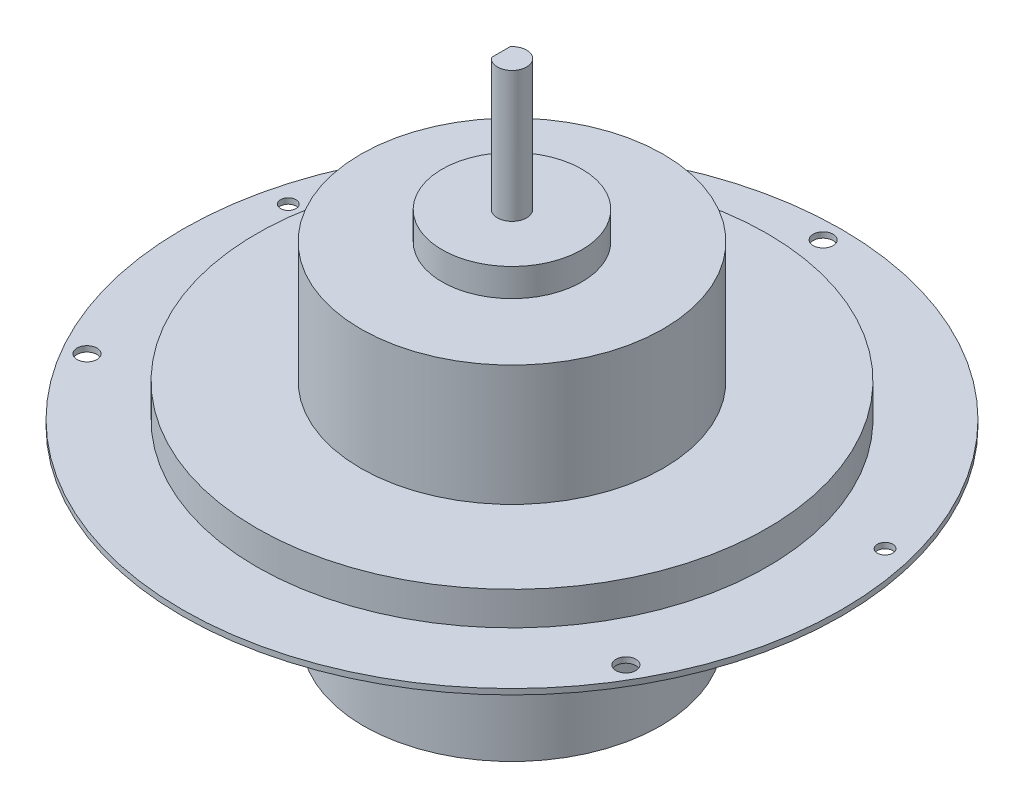
ISO-10303-21;
HEADER;
FILE_DESCRIPTION(('STEP AP214'),'2;1');
FILE_NAME('part.step','',(''),(''),'','','');
FILE_SCHEMA(('AUTOMOTIVE_DESIGN { 1 0 10303 214 1 1 1 1 }'));
ENDSEC;
DATA;
#1=APPLICATION_CONTEXT('core data for automotive mechanical design processes');
#2=APPLICATION_PROTOCOL_DEFINITION('international standard','automotive_design',2000,#1);
#3=PRODUCT_CONTEXT('',#1,'mechanical');
#4=PRODUCT('Part','Part','',(#3));
#5=PRODUCT_RELATED_PRODUCT_CATEGORY('part','',(#4));
#6=PRODUCT_DEFINITION_FORMATION('','',#4);
#7=PRODUCT_DEFINITION_CONTEXT('part definition',#1,'design');
#8=PRODUCT_DEFINITION('design','',#6,#7);
#9=PRODUCT_DEFINITION_SHAPE('','',#8);
#10=(LENGTH_UNIT() NAMED_UNIT(*) SI_UNIT(.MILLI.,.METRE.));
#11=(NAMED_UNIT(*) PLANE_ANGLE_UNIT() SI_UNIT($,.RADIAN.));
#12=(NAMED_UNIT(*) SI_UNIT($,.STERADIAN.) SOLID_ANGLE_UNIT());
#13=UNCERTAINTY_MEASURE_WITH_UNIT(LENGTH_MEASURE(1.E-05),#10,'distance_accuracy_value','');
#14=(GEOMETRIC_REPRESENTATION_CONTEXT(3) GLOBAL_UNCERTAINTY_ASSIGNED_CONTEXT((#13)) GLOBAL_UNIT_ASSIGNED_CONTEXT((#10,
#11,#12)) REPRESENTATION_CONTEXT('',''));
#15=CARTESIAN_POINT('',(0.,0.,0.));
#16=DIRECTION('',(0.,0.,1.));
#17=DIRECTION('',(1.,0.,0.));
#18=AXIS2_PLACEMENT_3D('',#15,#16,#17);
#19=CARTESIAN_POINT('',(0.,0.762000000000013,0.));
#20=DIRECTION('',(0.,-1.,0.));
#21=DIRECTION('',(0.,0.,-1.));
#22=AXIS2_PLACEMENT_3D('',#19,#20,#21);
#23=CYLINDRICAL_SURFACE('',#22,90.17);
#24=CARTESIAN_POINT('',(0.,0.762000000000013,0.));
#25=DIRECTION('',(0.,1.,0.));
#26=DIRECTION('',(0.,0.,1.));
#27=AXIS2_PLACEMENT_3D('',#24,#25,#26);
#28=CIRCLE('',#27,90.17);
#29=CARTESIAN_POINT('',(0.,0.762000000000013,-90.17));
#30=VERTEX_POINT('',#29);
#31=EDGE_CURVE('E122',#30,#30,#28,.T.);
#32=CARTESIAN_POINT('',(0.,-0.762000000000013,0.));
#33=DIRECTION('',(0.,1.,0.));
#34=DIRECTION('',(0.,0.,1.));
#35=AXIS2_PLACEMENT_3D('',#32,#33,#34);
#36=CIRCLE('',#35,90.17);
#37=CARTESIAN_POINT('',(0.,-0.762000000000013,-90.17));
#38=VERTEX_POINT('',#37);
#39=EDGE_CURVE('E118',#38,#38,#36,.T.);
#40=CARTESIAN_POINT('',(0.,0.762000000000013,-90.17));
#41=CARTESIAN_POINT('',(0.,0.746125000000012,-90.17));
#42=CARTESIAN_POINT('',(0.,0.730250000000012,-90.17));
#43=CARTESIAN_POINT('',(0.,0.698500000000012,-90.17));
#44=CARTESIAN_POINT('',(0.,0.682625000000011,-90.17));
#45=CARTESIAN_POINT('',(0.,0.650875000000011,-90.17));
#46=CARTESIAN_POINT('',(0.,0.63500000000001,-90.17));
#47=CARTESIAN_POINT('',(0.,0.60325000000001,-90.17));
#48=CARTESIAN_POINT('',(0.,0.58737500000001,-90.17));
#49=CARTESIAN_POINT('',(0.,0.555625000000009,-90.17));
#50=CARTESIAN_POINT('',(0.,0.539750000000009,-90.17));
#51=CARTESIAN_POINT('',(0.,0.508000000000008,-90.17));
#52=CARTESIAN_POINT('',(0.,0.492125000000008,-90.17));
#53=CARTESIAN_POINT('',(0.,0.460375000000008,-90.17));
#54=CARTESIAN_POINT('',(0.,0.444500000000007,-90.17));
#55=CARTESIAN_POINT('',(0.,0.412750000000007,-90.17));
#56=CARTESIAN_POINT('',(0.,0.396875000000006,-90.17));
#57=CARTESIAN_POINT('',(0.,0.365125000000006,-90.17));
#58=CARTESIAN_POINT('',(0.,0.349250000000006,-90.17));
#59=CARTESIAN_POINT('',(0.,0.317500000000005,-90.17));
#60=CARTESIAN_POINT('',(0.,0.301625000000005,-90.17));
#61=CARTESIAN_POINT('',(0.,0.269875000000004,-90.17));
#62=CARTESIAN_POINT('',(0.,0.254000000000004,-90.17));
#63=CARTESIAN_POINT('',(0.,0.222250000000004,-90.17));
#64=CARTESIAN_POINT('',(0.,0.206375000000003,-90.17));
#65=CARTESIAN_POINT('',(0.,0.174625000000003,-90.17));
#66=CARTESIAN_POINT('',(0.,0.158750000000002,-90.17));
#67=CARTESIAN_POINT('',(0.,0.127000000000002,-90.17));
#68=CARTESIAN_POINT('',(0.,0.111125000000002,-90.17));
#69=CARTESIAN_POINT('',(0.,0.0793750000000011,-90.17));
#70=CARTESIAN_POINT('',(0.,0.0635000000000008,-90.17));
#71=CARTESIAN_POINT('',(0.,0.0317500000000003,-90.17));
#72=CARTESIAN_POINT('',(0.,0.015875,-90.17));
#73=CARTESIAN_POINT('',(0.,-0.0158750000000005,-90.17));
#74=CARTESIAN_POINT('',(0.,-0.0317500000000007,-90.17));
#75=CARTESIAN_POINT('',(0.,-0.0635000000000013,-90.17));
#76=CARTESIAN_POINT('',(0.,-0.0793750000000015,-90.17));
#77=CARTESIAN_POINT('',(0.,-0.111125000000002,-90.17));
#78=CARTESIAN_POINT('',(0.,-0.127000000000002,-90.17));
#79=CARTESIAN_POINT('',(0.,-0.158750000000003,-90.17));
#80=CARTESIAN_POINT('',(0.,-0.174625000000003,-90.17));
#81=CARTESIAN_POINT('',(0.,-0.206375000000004,-90.17));
#82=CARTESIAN_POINT('',(0.,-0.222250000000004,-90.17));
#83=CARTESIAN_POINT('',(0.,-0.254000000000004,-90.17));
#84=CARTESIAN_POINT('',(0.,-0.269875000000004,-90.17));
#85=CARTESIAN_POINT('',(0.,-0.301625000000005,-90.17));
#86=CARTESIAN_POINT('',(0.,-0.317500000000005,-90.17));
#87=CARTESIAN_POINT('',(0.,-0.349250000000006,-90.17));
#88=CARTESIAN_POINT('',(0.,-0.365125000000006,-90.17));
#89=CARTESIAN_POINT('',(0.,-0.396875000000007,-90.17));
#90=CARTESIAN_POINT('',(0.,-0.412750000000007,-90.17));
#91=CARTESIAN_POINT('',(0.,-0.444500000000008,-90.17));
#92=CARTESIAN_POINT('',(0.,-0.460375000000008,-90.17));
#93=CARTESIAN_POINT('',(0.,-0.492125000000008,-90.17));
#94=CARTESIAN_POINT('',(0.,-0.508000000000009,-90.17));
#95=CARTESIAN_POINT('',(0.,-0.539750000000009,-90.17));
#96=CARTESIAN_POINT('',(0.,-0.555625000000009,-90.17));
#97=CARTESIAN_POINT('',(0.,-0.58737500000001,-90.17));
#98=CARTESIAN_POINT('',(0.,-0.60325000000001,-90.17));
#99=CARTESIAN_POINT('',(0.,-0.635000000000011,-90.17));
#100=CARTESIAN_POINT('',(0.,-0.650875000000011,-90.17));
#101=CARTESIAN_POINT('',(0.,-0.682625000000012,-90.17));
#102=CARTESIAN_POINT('',(0.,-0.698500000000012,-90.17));
#103=CARTESIAN_POINT('',(0.,-0.730250000000012,-90.17));
#104=CARTESIAN_POINT('',(0.,-0.746125000000013,-90.17));
#105=CARTESIAN_POINT('',(0.,-0.762000000000013,-90.17));
#106=B_SPLINE_CURVE_WITH_KNOTS('',3,(#40,#41,#42,#43,#44,#45,#46,#47,#48,#49,#50,#51,#52,#53,
#54,#55,#56,#57,#58,#59,#60,#61,#62,#63,#64,#65,#66,#67,#68,#69,#70,#71,#72,#73,#74,#75,#76,#77,
#78,#79,#80,#81,#82,#83,#84,#85,#86,#87,#88,#89,#90,#91,#92,#93,#94,#95,#96,#97,#98,#99,#100,
#101,#102,#103,#104,#105),.UNSPECIFIED.,.F.,.F.,(4,2,2,2,2,2,2,2,2,2,2,2,2,2,2,2,2,2,2,2,2,2,2,
2,2,2,2,2,2,2,2,2,4),(0.,0.0476250000000008,0.0952500000000016,0.142875000000002,
0.190500000000003,0.238125000000004,0.285750000000005,0.333375000000006,0.381000000000006,
0.428625000000007,0.476250000000008,0.523875000000009,0.57150000000001,0.61912500000001,
0.666750000000011,0.714375000000012,0.762000000000013,0.809625000000014,0.857250000000014,
0.904875000000015,0.952500000000016,1.00012500000002,1.04775000000002,1.09537500000002,
1.14300000000002,1.19062500000002,1.23825000000002,1.28587500000002,1.33350000000002,
1.38112500000002,1.42875000000002,1.47637500000002,1.52400000000003),.UNSPECIFIED.);
#107=EDGE_CURVE('BSEAM42',#30,#38,#106,.T.);
#108=ORIENTED_EDGE('',*,*,#31,.F.);
#109=ORIENTED_EDGE('',*,*,#39,.T.);
#110=ORIENTED_EDGE('',*,*,#107,.T.);
#111=ORIENTED_EDGE('',*,*,#107,.F.);
#112=EDGE_LOOP('',(#108,#110,#109,#111));
#113=FACE_BOUND('',#112,.T.);
#114=ADVANCED_FACE('F42',(#113),#23,.T.);
#115=CARTESIAN_POINT('',(0.,0.762000000000013,0.));
#116=DIRECTION('',(0.,1.,0.));
#117=DIRECTION('',(0.,0.,1.));
#118=AXIS2_PLACEMENT_3D('',#115,#116,#117);
#119=PLANE('',#118);
#120=CARTESIAN_POINT('',(-81.657901206185,0.762000000000013,-20.4332769266442));
#121=DIRECTION('',(0.,1.,0.));
#122=DIRECTION('',(0.,0.,1.));
#123=AXIS2_PLACEMENT_3D('',#120,#121,#122);
#124=CIRCLE('',#123,2.12089999999999);
#125=CARTESIAN_POINT('',(-81.657901206185,0.762000000000013,-18.3123769266442));
#126=VERTEX_POINT('',#125);
#127=EDGE_CURVE('E148',#126,#126,#124,.T.);
#128=ORIENTED_EDGE('',*,*,#127,.F.);
#129=EDGE_LOOP('',(#128));
#130=FACE_BOUND('',#129,.T.);
#131=CARTESIAN_POINT('',(81.6579012061849,0.762000000000013,-20.4332769266448));
#132=DIRECTION('',(0.,1.,0.));
#133=DIRECTION('',(0.,0.,-1.));
#134=AXIS2_PLACEMENT_3D('',#131,#132,#133);
#135=CIRCLE('',#134,2.12090000000001);
#136=CARTESIAN_POINT('',(81.6579012061849,0.762000000000013,-22.5541769266448));
#137=VERTEX_POINT('',#136);
#138=EDGE_CURVE('E376',#137,#137,#135,.T.);
#139=ORIENTED_EDGE('',*,*,#138,.F.);
#140=EDGE_LOOP('',(#139));
#141=FACE_BOUND('',#140,.T.);
#142=CARTESIAN_POINT('',(0.,0.762000000000013,-85.1408));
#143=DIRECTION('',(0.,1.,0.));
#144=DIRECTION('',(0.,0.,1.));
#145=AXIS2_PLACEMENT_3D('',#142,#143,#144);
#146=CIRCLE('',#145,2.7178);
#147=CARTESIAN_POINT('',(0.,0.762000000000013,-82.423));
#148=VERTEX_POINT('',#147);
#149=EDGE_CURVE('E136',#148,#148,#146,.T.);
#150=ORIENTED_EDGE('',*,*,#149,.F.);
#151=EDGE_LOOP('',(#150));
#152=FACE_BOUND('',#151,.T.);
#153=CARTESIAN_POINT('',(73.7340956985299,0.762000000000013,42.5704000000004));
#154=DIRECTION('',(0.,1.,0.));
#155=DIRECTION('',(0.,0.,1.));
#156=AXIS2_PLACEMENT_3D('',#153,#154,#155);
#157=CIRCLE('',#156,2.71780000000001);
#158=CARTESIAN_POINT('',(73.7340956985299,0.762000000000013,45.2882000000004));
#159=VERTEX_POINT('',#158);
#160=EDGE_CURVE('E157',#159,#159,#157,.T.);
#161=ORIENTED_EDGE('',*,*,#160,.F.);
#162=EDGE_LOOP('',(#161));
#163=FACE_BOUND('',#162,.T.);
#164=CARTESIAN_POINT('',(-73.7340956985305,0.762000000000013,42.5703999999993));
#165=DIRECTION('',(0.,1.,0.));
#166=DIRECTION('',(0.,0.,1.));
#167=AXIS2_PLACEMENT_3D('',#164,#165,#166);
#168=CIRCLE('',#167,2.7178);
#169=CARTESIAN_POINT('',(-73.7340956985305,0.762000000000013,45.2881999999993));
#170=VERTEX_POINT('',#169);
#171=EDGE_CURVE('E151',#170,#170,#168,.T.);
#172=ORIENTED_EDGE('',*,*,#171,.F.);
#173=EDGE_LOOP('',(#172));
#174=FACE_BOUND('',#173,.T.);
#175=CARTESIAN_POINT('',(0.,0.762000000000013,0.));
#176=DIRECTION('',(0.,1.,0.));
#177=DIRECTION('',(0.,0.,1.));
#178=AXIS2_PLACEMENT_3D('',#175,#176,#177);
#179=CIRCLE('',#178,69.85);
#180=CARTESIAN_POINT('',(0.,0.762000000000013,69.85));
#181=VERTEX_POINT('',#180);
#182=EDGE_CURVE('E114',#181,#181,#179,.T.);
#183=ORIENTED_EDGE('',*,*,#182,.F.);
#184=EDGE_LOOP('',(#183));
#185=FACE_BOUND('',#184,.T.);
#186=ORIENTED_EDGE('',*,*,#31,.T.);
#187=EDGE_LOOP('',(#186));
#188=FACE_BOUND('',#187,.T.);
#189=ADVANCED_FACE('F180',(#130,#141,#152,#163,#174,#185,#188),#119,.T.);
#190=CARTESIAN_POINT('',(0.,-0.762000000000013,0.));
#191=DIRECTION('',(0.,1.,0.));
#192=DIRECTION('',(0.,0.,1.));
#193=AXIS2_PLACEMENT_3D('',#190,#191,#192);
#194=PLANE('',#193);
#195=CARTESIAN_POINT('',(0.,-0.762000000000013,0.));
#196=DIRECTION('',(0.,1.,0.));
#197=DIRECTION('',(0.,0.,1.));
#198=AXIS2_PLACEMENT_3D('',#195,#196,#197);
#199=CIRCLE('',#198,40.64);
#200=CARTESIAN_POINT('',(0.,-0.762000000000013,40.6400000000001));
#201=VERTEX_POINT('',#200);
#202=EDGE_CURVE('E11',#201,#201,#199,.F.);
#203=ORIENTED_EDGE('',*,*,#202,.F.);
#204=EDGE_LOOP('',(#203));
#205=FACE_BOUND('',#204,.T.);
#206=CARTESIAN_POINT('',(-81.657901206185,-0.761999999999985,-20.4332769266442));
#207=DIRECTION('',(0.,1.,0.));
#208=DIRECTION('',(0.,0.,1.));
#209=AXIS2_PLACEMENT_3D('',#206,#207,#208);
#210=CIRCLE('',#209,2.12089999999999);
#211=CARTESIAN_POINT('',(-81.657901206185,-0.761999999999985,-18.3123769266442));
#212=VERTEX_POINT('',#211);
#213=EDGE_CURVE('E147',#212,#212,#210,.T.);
#214=ORIENTED_EDGE('',*,*,#213,.T.);
#215=EDGE_LOOP('',(#214));
#216=FACE_BOUND('',#215,.T.);
#217=CARTESIAN_POINT('',(81.6579012061849,-0.761999999999985,-20.4332769266447));
#218=DIRECTION('',(0.,1.,0.));
#219=DIRECTION('',(0.,0.,1.));
#220=AXIS2_PLACEMENT_3D('',#217,#218,#219);
#221=CIRCLE('',#220,2.12090000000001);
#222=CARTESIAN_POINT('',(81.6579012061849,-0.761999999999985,-18.3123769266447));
#223=VERTEX_POINT('',#222);
#224=EDGE_CURVE('E144',#223,#223,#221,.T.);
#225=ORIENTED_EDGE('',*,*,#224,.T.);
#226=EDGE_LOOP('',(#225));
#227=FACE_BOUND('',#226,.T.);
#228=CARTESIAN_POINT('',(0.,-0.761999999999985,-85.1407999999999));
#229=DIRECTION('',(0.,1.,0.));
#230=DIRECTION('',(0.,0.,1.));
#231=AXIS2_PLACEMENT_3D('',#228,#229,#230);
#232=CIRCLE('',#231,2.7178);
#233=CARTESIAN_POINT('',(0.,-0.761999999999985,-82.4229999999999));
#234=VERTEX_POINT('',#233);
#235=EDGE_CURVE('E140',#234,#234,#232,.T.);
#236=ORIENTED_EDGE('',*,*,#235,.T.);
#237=EDGE_LOOP('',(#236));
#238=FACE_BOUND('',#237,.T.);
#239=CARTESIAN_POINT('',(73.7340956985299,-0.761999999999985,42.5704000000004));
#240=DIRECTION('',(0.,1.,0.));
#241=DIRECTION('',(0.,0.,1.));
#242=AXIS2_PLACEMENT_3D('',#239,#240,#241);
#243=CIRCLE('',#242,2.71780000000001);
#244=CARTESIAN_POINT('',(73.7340956985299,-0.761999999999985,45.2882000000004));
#245=VERTEX_POINT('',#244);
#246=EDGE_CURVE('E135',#245,#245,#243,.T.);
#247=ORIENTED_EDGE('',*,*,#246,.T.);
#248=EDGE_LOOP('',(#247));
#249=FACE_BOUND('',#248,.T.);
#250=CARTESIAN_POINT('',(-73.7340956985305,-0.761999999999985,42.5703999999993));
#251=DIRECTION('',(0.,1.,0.));
#252=DIRECTION('',(0.,0.,1.));
#253=AXIS2_PLACEMENT_3D('',#250,#251,#252);
#254=CIRCLE('',#253,2.7178);
#255=CARTESIAN_POINT('',(-73.7340956985305,-0.761999999999985,45.2881999999993));
#256=VERTEX_POINT('',#255);
#257=EDGE_CURVE('E131',#256,#256,#254,.T.);
#258=ORIENTED_EDGE('',*,*,#257,.T.);
#259=EDGE_LOOP('',(#258));
#260=FACE_BOUND('',#259,.T.);
#261=ORIENTED_EDGE('',*,*,#39,.F.);
#262=EDGE_LOOP('',(#261));
#263=FACE_BOUND('',#262,.T.);
#264=ADVANCED_FACE('F185',(#205,#216,#227,#238,#249,#260,#263),#194,.F.);
#265=CARTESIAN_POINT('',(0.,9.906,0.));
#266=DIRECTION('',(0.,-1.,0.));
#267=DIRECTION('',(0.,0.,-1.));
#268=AXIS2_PLACEMENT_3D('',#265,#266,#267);
#269=CYLINDRICAL_SURFACE('',#268,69.85);
#270=CARTESIAN_POINT('',(0.,9.906,0.));
#271=DIRECTION('',(0.,1.,0.));
#272=DIRECTION('',(0.,0.,1.));
#273=AXIS2_PLACEMENT_3D('',#270,#271,#272);
#274=CIRCLE('',#273,69.85);
#275=CARTESIAN_POINT('',(0.,9.906,69.85));
#276=VERTEX_POINT('',#275);
#277=EDGE_CURVE('E110',#276,#276,#274,.T.);
#278=ORIENTED_EDGE('',*,*,#277,.F.);
#279=EDGE_LOOP('',(#278));
#280=FACE_BOUND('',#279,.T.);
#281=ORIENTED_EDGE('',*,*,#182,.T.);
#282=EDGE_LOOP('',(#281));
#283=FACE_BOUND('',#282,.T.);
#284=ADVANCED_FACE('F193',(#280,#283),#269,.T.);
#285=CARTESIAN_POINT('',(0.,9.906,0.));
#286=DIRECTION('',(0.,1.,0.));
#287=DIRECTION('',(0.,0.,1.));
#288=AXIS2_PLACEMENT_3D('',#285,#286,#287);
#289=PLANE('',#288);
#290=CARTESIAN_POINT('',(0.,9.906,0.));
#291=DIRECTION('',(0.,1.,0.));
#292=DIRECTION('',(0.,0.,1.));
#293=AXIS2_PLACEMENT_3D('',#290,#291,#292);
#294=CIRCLE('',#293,41.402);
#295=CARTESIAN_POINT('',(0.,9.906,41.402));
#296=VERTEX_POINT('',#295);
#297=EDGE_CURVE('E106',#296,#296,#294,.T.);
#298=ORIENTED_EDGE('',*,*,#297,.F.);
#299=EDGE_LOOP('',(#298));
#300=FACE_BOUND('',#299,.T.);
#301=ORIENTED_EDGE('',*,*,#277,.T.);
#302=EDGE_LOOP('',(#301));
#303=FACE_BOUND('',#302,.T.);
#304=ADVANCED_FACE('F198',(#300,#303),#289,.T.);
#305=CARTESIAN_POINT('',(0.,42.926,0.));
#306=DIRECTION('',(0.,-1.,0.));
#307=DIRECTION('',(0.,0.,-1.));
#308=AXIS2_PLACEMENT_3D('',#305,#306,#307);
#309=CYLINDRICAL_SURFACE('',#308,41.402);
#310=CARTESIAN_POINT('',(0.,42.926,0.));
#311=DIRECTION('',(0.,1.,0.));
#312=DIRECTION('',(0.,0.,1.));
#313=AXIS2_PLACEMENT_3D('',#310,#311,#312);
#314=CIRCLE('',#313,41.402);
#315=CARTESIAN_POINT('',(0.,42.926,41.4020000000001));
#316=VERTEX_POINT('',#315);
#317=EDGE_CURVE('E94',#316,#316,#314,.T.);
#318=ORIENTED_EDGE('',*,*,#317,.F.);
#319=EDGE_LOOP('',(#318));
#320=FACE_BOUND('',#319,.T.);
#321=ORIENTED_EDGE('',*,*,#297,.T.);
#322=EDGE_LOOP('',(#321));
#323=FACE_BOUND('',#322,.T.);
#324=ADVANCED_FACE('F205',(#320,#323),#309,.T.);
#325=CARTESIAN_POINT('',(0.,42.926,0.));
#326=DIRECTION('',(0.,1.,0.));
#327=DIRECTION('',(0.,0.,1.));
#328=AXIS2_PLACEMENT_3D('',#325,#326,#327);
#329=PLANE('',#328);
#330=CARTESIAN_POINT('',(0.,42.926,0.));
#331=DIRECTION('',(0.,1.,0.));
#332=DIRECTION('',(0.,0.,1.));
#333=AXIS2_PLACEMENT_3D('',#330,#331,#332);
#334=CIRCLE('',#333,19.1262);
#335=CARTESIAN_POINT('',(0.,42.926,-19.1261999999999));
#336=VERTEX_POINT('',#335);
#337=EDGE_CURVE('E101',#336,#336,#334,.T.);
#338=ORIENTED_EDGE('',*,*,#337,.F.);
#339=EDGE_LOOP('',(#338));
#340=FACE_BOUND('',#339,.T.);
#341=ORIENTED_EDGE('',*,*,#317,.T.);
#342=EDGE_LOOP('',(#341));
#343=FACE_BOUND('',#342,.T.);
#344=ADVANCED_FACE('F209',(#340,#343),#329,.T.);
#345=CARTESIAN_POINT('',(0.,50.546,0.));
#346=DIRECTION('',(0.,-1.,0.));
#347=DIRECTION('',(0.,0.,-1.));
#348=AXIS2_PLACEMENT_3D('',#345,#346,#347);
#349=CYLINDRICAL_SURFACE('',#348,19.1262);
#350=CARTESIAN_POINT('',(0.,50.546,0.));
#351=DIRECTION('',(0.,1.,0.));
#352=DIRECTION('',(0.,0.,1.));
#353=AXIS2_PLACEMENT_3D('',#350,#351,#352);
#354=CIRCLE('',#353,19.1262);
#355=CARTESIAN_POINT('',(0.,50.546,-19.1261999999999));
#356=VERTEX_POINT('',#355);
#357=EDGE_CURVE('E90',#356,#356,#354,.T.);
#358=CARTESIAN_POINT('',(0.,50.546,-19.1261999999999));
#359=CARTESIAN_POINT('',(0.,50.466625,-19.1261999999999));
#360=CARTESIAN_POINT('',(0.,50.38725,-19.1261999999999));
#361=CARTESIAN_POINT('',(0.,50.2285,-19.1261999999999));
#362=CARTESIAN_POINT('',(0.,50.149125,-19.1261999999999));
#363=CARTESIAN_POINT('',(0.,49.990375,-19.1261999999999));
#364=CARTESIAN_POINT('',(0.,49.911,-19.1261999999999));
#365=CARTESIAN_POINT('',(0.,49.75225,-19.1261999999999));
#366=CARTESIAN_POINT('',(0.,49.672875,-19.1261999999999));
#367=CARTESIAN_POINT('',(0.,49.514125,-19.1261999999999));
#368=CARTESIAN_POINT('',(0.,49.43475,-19.1261999999999));
#369=CARTESIAN_POINT('',(0.,49.276,-19.1261999999999));
#370=CARTESIAN_POINT('',(0.,49.196625,-19.1261999999999));
#371=CARTESIAN_POINT('',(0.,49.037875,-19.1261999999999));
#372=CARTESIAN_POINT('',(0.,48.9585,-19.1261999999999));
#373=CARTESIAN_POINT('',(0.,48.79975,-19.1261999999999));
#374=CARTESIAN_POINT('',(0.,48.720375,-19.1261999999999));
#375=CARTESIAN_POINT('',(0.,48.561625,-19.1261999999999));
#376=CARTESIAN_POINT('',(0.,48.48225,-19.1261999999999));
#377=CARTESIAN_POINT('',(0.,48.3235,-19.1261999999999));
#378=CARTESIAN_POINT('',(0.,48.244125,-19.1261999999999));
#379=CARTESIAN_POINT('',(0.,48.085375,-19.1261999999999));
#380=CARTESIAN_POINT('',(0.,48.006,-19.1261999999999));
#381=CARTESIAN_POINT('',(0.,47.84725,-19.1261999999999));
#382=CARTESIAN_POINT('',(0.,47.767875,-19.1261999999999));
#383=CARTESIAN_POINT('',(0.,47.609125,-19.1261999999999));
#384=CARTESIAN_POINT('',(0.,47.52975,-19.1261999999999));
#385=CARTESIAN_POINT('',(0.,47.371,-19.1261999999999));
#386=CARTESIAN_POINT('',(0.,47.291625,-19.1261999999999));
#387=CARTESIAN_POINT('',(0.,47.132875,-19.1261999999999));
#388=CARTESIAN_POINT('',(0.,47.0535,-19.1261999999999));
#389=CARTESIAN_POINT('',(0.,46.89475,-19.1261999999999));
#390=CARTESIAN_POINT('',(0.,46.815375,-19.1261999999999));
#391=CARTESIAN_POINT('',(0.,46.656625,-19.1261999999999));
#392=CARTESIAN_POINT('',(0.,46.57725,-19.1261999999999));
#393=CARTESIAN_POINT('',(0.,46.4185,-19.1261999999999));
#394=CARTESIAN_POINT('',(0.,46.339125,-19.1261999999999));
#395=CARTESIAN_POINT('',(0.,46.180375,-19.1261999999999));
#396=CARTESIAN_POINT('',(0.,46.101,-19.1261999999999));
#397=CARTESIAN_POINT('',(0.,45.94225,-19.1261999999999));
#398=CARTESIAN_POINT('',(0.,45.862875,-19.1261999999999));
#399=CARTESIAN_POINT('',(0.,45.704125,-19.1261999999999));
#400=CARTESIAN_POINT('',(0.,45.62475,-19.1261999999999));
#401=CARTESIAN_POINT('',(0.,45.466,-19.1261999999999));
#402=CARTESIAN_POINT('',(0.,45.386625,-19.1261999999999));
#403=CARTESIAN_POINT('',(0.,45.227875,-19.1261999999999));
#404=CARTESIAN_POINT('',(0.,45.1485,-19.1261999999999));
#405=CARTESIAN_POINT('',(0.,44.98975,-19.1261999999999));
#406=CARTESIAN_POINT('',(0.,44.910375,-19.1261999999999));
#407=CARTESIAN_POINT('',(0.,44.751625,-19.1261999999999));
#408=CARTESIAN_POINT('',(0.,44.67225,-19.1261999999999));
#409=CARTESIAN_POINT('',(0.,44.5135,-19.1261999999999));
#410=CARTESIAN_POINT('',(0.,44.434125,-19.1261999999999));
#411=CARTESIAN_POINT('',(0.,44.275375,-19.1261999999999));
#412=CARTESIAN_POINT('',(0.,44.196,-19.1261999999999));
#413=CARTESIAN_POINT('',(0.,44.03725,-19.1261999999999));
#414=CARTESIAN_POINT('',(0.,43.957875,-19.1261999999999));
#415=CARTESIAN_POINT('',(0.,43.799125,-19.1261999999999));
#416=CARTESIAN_POINT('',(0.,43.71975,-19.1261999999999));
#417=CARTESIAN_POINT('',(0.,43.561,-19.1261999999999));
#418=CARTESIAN_POINT('',(0.,43.481625,-19.1261999999999));
#419=CARTESIAN_POINT('',(0.,43.322875,-19.1261999999999));
#420=CARTESIAN_POINT('',(0.,43.2435,-19.1261999999999));
#421=CARTESIAN_POINT('',(0.,43.08475,-19.1261999999999));
#422=CARTESIAN_POINT('',(0.,43.005375,-19.1261999999999));
#423=CARTESIAN_POINT('',(0.,42.926,-19.1261999999999));
#424=B_SPLINE_CURVE_WITH_KNOTS('',3,(#358,#359,#360,#361,#362,#363,#364,#365,#366,#367,#368,
#369,#370,#371,#372,#373,#374,#375,#376,#377,#378,#379,#380,#381,#382,#383,#384,#385,#386,#387,
#388,#389,#390,#391,#392,#393,#394,#395,#396,#397,#398,#399,#400,#401,#402,#403,#404,#405,#406,
#407,#408,#409,#410,#411,#412,#413,#414,#415,#416,#417,#418,#419,#420,#421,#422,#423),
.UNSPECIFIED.,.F.,.F.,(4,2,2,2,2,2,2,2,2,2,2,2,2,2,2,2,2,2,2,2,2,2,2,2,2,2,2,2,2,2,2,2,4),(0.,
0.238125000000006,0.476250000000004,0.714375000000003,0.952500000000009,1.19062500000001,
1.42875000000001,1.66687500000001,1.90500000000001,2.14312500000001,2.38125000000001,
2.61937500000001,2.85750000000001,3.09562500000001,3.33375000000001,3.57187500000001,
3.81000000000001,4.04812500000001,4.28625000000001,4.52437500000001,4.76250000000002,
5.00062500000002,5.23875000000001,5.47687500000001,5.71500000000002,5.95312500000002,
6.19125000000002,6.42937500000001,6.66750000000002,6.90562500000002,7.14375000000002,
7.38187500000002,7.62000000000002),.UNSPECIFIED.);
#425=EDGE_CURVE('BSEAM213',#356,#336,#424,.T.);
#426=ORIENTED_EDGE('',*,*,#357,.F.);
#427=ORIENTED_EDGE('',*,*,#337,.T.);
#428=ORIENTED_EDGE('',*,*,#425,.T.);
#429=ORIENTED_EDGE('',*,*,#425,.F.);
#430=EDGE_LOOP('',(#426,#428,#427,#429));
#431=FACE_BOUND('',#430,.T.);
#432=ADVANCED_FACE('F213',(#431),#349,.T.);
#433=CARTESIAN_POINT('',(0.,50.546,0.));
#434=DIRECTION('',(0.,1.,0.));
#435=DIRECTION('',(0.,0.,1.));
#436=AXIS2_PLACEMENT_3D('',#433,#434,#435);
#437=PLANE('',#436);
#438=CARTESIAN_POINT('',(0.,50.546,0.));
#439=DIRECTION('',(0.,1.,0.));
#440=DIRECTION('',(0.,0.,1.));
#441=AXIS2_PLACEMENT_3D('',#438,#439,#440);
#442=CIRCLE('',#441,4.0005);
#443=CARTESIAN_POINT('',(0.,50.546,4.00050000000005));
#444=VERTEX_POINT('',#443);
#445=EDGE_CURVE('E78',#444,#444,#442,.T.);
#446=ORIENTED_EDGE('',*,*,#445,.F.);
#447=EDGE_LOOP('',(#446));
#448=FACE_BOUND('',#447,.T.);
#449=ORIENTED_EDGE('',*,*,#357,.T.);
#450=EDGE_LOOP('',(#449));
#451=FACE_BOUND('',#450,.T.);
#452=ADVANCED_FACE('F217',(#448,#451),#437,.T.);
#453=CARTESIAN_POINT('',(0.,86.3092,0.));
#454=DIRECTION('',(0.,-1.,0.));
#455=DIRECTION('',(0.,0.,-1.));
#456=AXIS2_PLACEMENT_3D('',#453,#454,#455);
#457=CYLINDRICAL_SURFACE('',#456,4.0005);
#458=CARTESIAN_POINT('',(0.,86.3092,0.));
#459=DIRECTION('',(0.,1.,0.));
#460=DIRECTION('',(0.,0.,1.));
#461=AXIS2_PLACEMENT_3D('',#458,#459,#460);
#462=CIRCLE('',#461,4.0005);
#463=CARTESIAN_POINT('',(-3.0734,86.3092,2.56090075754611));
#464=VERTEX_POINT('',#463);
#465=CARTESIAN_POINT('',(-3.0734,86.3092,-2.56090075754603));
#466=VERTEX_POINT('',#465);
#467=EDGE_CURVE('E84',#464,#466,#462,.T.);
#468=ORIENTED_EDGE('',*,*,#467,.F.);
#469=DIRECTION('',(0.,-1.,0.));
#470=VECTOR('',#469,1.);
#471=CARTESIAN_POINT('',(-3.0734,86.3092,2.56090075754611));
#472=LINE('',#471,#470);
#473=CARTESIAN_POINT('',(-3.0734,61.849,2.56090075754611));
#474=VERTEX_POINT('',#473);
#475=EDGE_CURVE('E60',#464,#474,#472,.T.);
#476=ORIENTED_EDGE('',*,*,#475,.T.);
#477=CARTESIAN_POINT('',(0.,61.849,0.));
#478=DIRECTION('',(0.,1.,0.));
#479=DIRECTION('',(0.,0.,1.));
#480=AXIS2_PLACEMENT_3D('',#477,#478,#479);
#481=CIRCLE('',#480,4.0005);
#482=CARTESIAN_POINT('',(-3.0734,61.849,-2.56090075754603));
#483=VERTEX_POINT('',#482);
#484=EDGE_CURVE('E50',#483,#474,#481,.T.);
#485=ORIENTED_EDGE('',*,*,#484,.F.);
#486=DIRECTION('',(0.,-1.,0.));
#487=VECTOR('',#486,1.);
#488=CARTESIAN_POINT('',(-3.0734,86.3092,-2.56090075754603));
#489=LINE('',#488,#487);
#490=EDGE_CURVE('E66',#483,#466,#489,.F.);
#491=ORIENTED_EDGE('',*,*,#490,.T.);
#492=EDGE_LOOP('',(#468,#476,#485,#491));
#493=FACE_BOUND('',#492,.T.);
#494=ORIENTED_EDGE('',*,*,#445,.T.);
#495=EDGE_LOOP('',(#494));
#496=FACE_BOUND('',#495,.T.);
#497=ADVANCED_FACE('F82',(#493,#496),#457,.T.);
#498=CARTESIAN_POINT('',(0.,86.3092,0.));
#499=DIRECTION('',(0.,1.,0.));
#500=DIRECTION('',(0.,0.,1.));
#501=AXIS2_PLACEMENT_3D('',#498,#499,#500);
#502=PLANE('',#501);
#503=DIRECTION('',(0.,0.,-1.));
#504=VECTOR('',#503,1.);
#505=CARTESIAN_POINT('',(-3.0734,86.3092,0.));
#506=LINE('',#505,#504);
#507=EDGE_CURVE('E72',#464,#466,#506,.T.);
#508=ORIENTED_EDGE('',*,*,#507,.F.);
#509=ORIENTED_EDGE('',*,*,#467,.T.);
#510=EDGE_LOOP('',(#508,#509));
#511=FACE_BOUND('',#510,.T.);
#512=ADVANCED_FACE('F88',(#511),#502,.T.);
#513=CARTESIAN_POINT('',(0.,61.849,0.));
#514=DIRECTION('',(0.,1.,0.));
#515=DIRECTION('',(0.,0.,1.));
#516=AXIS2_PLACEMENT_3D('',#513,#514,#515);
#517=PLANE('',#516);
#518=ORIENTED_EDGE('',*,*,#484,.T.);
#519=DIRECTION('',(0.,0.,-1.));
#520=VECTOR('',#519,1.);
#521=CARTESIAN_POINT('',(-3.0734,61.849,2.67970000000004));
#522=LINE('',#521,#520);
#523=EDGE_CURVE('E86',#474,#483,#522,.T.);
#524=ORIENTED_EDGE('',*,*,#523,.T.);
#525=EDGE_LOOP('',(#518,#524));
#526=FACE_BOUND('',#525,.T.);
#527=ADVANCED_FACE('F168',(#526),#517,.T.);
#528=CARTESIAN_POINT('',(-3.0734,61.849,2.67970000000004));
#529=DIRECTION('',(1.,0.,0.));
#530=DIRECTION('',(0.,0.,-1.));
#531=AXIS2_PLACEMENT_3D('',#528,#529,#530);
#532=PLANE('',#531);
#533=ORIENTED_EDGE('',*,*,#507,.T.);
#534=ORIENTED_EDGE('',*,*,#490,.F.);
#535=ORIENTED_EDGE('',*,*,#523,.F.);
#536=ORIENTED_EDGE('',*,*,#475,.F.);
#537=EDGE_LOOP('',(#533,#534,#535,#536));
#538=FACE_BOUND('',#537,.T.);
#539=ADVANCED_FACE('F73',(#538),#532,.F.);
#540=CARTESIAN_POINT('',(-73.7340956985305,-5.58799999999998,42.5703999999993));
#541=DIRECTION('',(0.,1.,0.));
#542=DIRECTION('',(0.,0.,1.));
#543=AXIS2_PLACEMENT_3D('',#540,#541,#542);
#544=CYLINDRICAL_SURFACE('',#543,2.7178);
#545=ORIENTED_EDGE('',*,*,#171,.T.);
#546=EDGE_LOOP('',(#545));
#547=FACE_BOUND('',#546,.T.);
#548=ORIENTED_EDGE('',*,*,#257,.F.);
#549=EDGE_LOOP('',(#548));
#550=FACE_BOUND('',#549,.T.);
#551=ADVANCED_FACE('F175',(#547,#550),#544,.F.);
#552=CARTESIAN_POINT('',(73.7340956985299,-5.58799999999998,42.5704000000004));
#553=DIRECTION('',(0.,1.,0.));
#554=DIRECTION('',(0.,0.,1.));
#555=AXIS2_PLACEMENT_3D('',#552,#553,#554);
#556=CYLINDRICAL_SURFACE('',#555,2.71780000000001);
#557=ORIENTED_EDGE('',*,*,#160,.T.);
#558=EDGE_LOOP('',(#557));
#559=FACE_BOUND('',#558,.T.);
#560=ORIENTED_EDGE('',*,*,#246,.F.);
#561=EDGE_LOOP('',(#560));
#562=FACE_BOUND('',#561,.T.);
#563=ADVANCED_FACE('F250',(#559,#562),#556,.F.);
#564=CARTESIAN_POINT('',(0.,-5.58799999999998,-85.1408));
#565=DIRECTION('',(0.,1.,0.));
#566=DIRECTION('',(0.,0.,1.));
#567=AXIS2_PLACEMENT_3D('',#564,#565,#566);
#568=CYLINDRICAL_SURFACE('',#567,2.7178);
#569=ORIENTED_EDGE('',*,*,#149,.T.);
#570=EDGE_LOOP('',(#569));
#571=FACE_BOUND('',#570,.T.);
#572=ORIENTED_EDGE('',*,*,#235,.F.);
#573=EDGE_LOOP('',(#572));
#574=FACE_BOUND('',#573,.T.);
#575=ADVANCED_FACE('F258',(#571,#574),#568,.F.);
#576=CARTESIAN_POINT('',(81.6579012061849,-5.58799999999998,-20.4332769266447));
#577=DIRECTION('',(0.,1.,0.));
#578=DIRECTION('',(0.,0.,1.));
#579=AXIS2_PLACEMENT_3D('',#576,#577,#578);
#580=CYLINDRICAL_SURFACE('',#579,2.12090000000001);
#581=ORIENTED_EDGE('',*,*,#138,.T.);
#582=EDGE_LOOP('',(#581));
#583=FACE_BOUND('',#582,.T.);
#584=ORIENTED_EDGE('',*,*,#224,.F.);
#585=EDGE_LOOP('',(#584));
#586=FACE_BOUND('',#585,.T.);
#587=ADVANCED_FACE('F268',(#583,#586),#580,.F.);
#588=CARTESIAN_POINT('',(-81.657901206185,-5.58799999999998,-20.4332769266442));
#589=DIRECTION('',(0.,1.,0.));
#590=DIRECTION('',(0.,0.,1.));
#591=AXIS2_PLACEMENT_3D('',#588,#589,#590);
#592=CYLINDRICAL_SURFACE('',#591,2.12089999999999);
#593=ORIENTED_EDGE('',*,*,#127,.T.);
#594=EDGE_LOOP('',(#593));
#595=FACE_BOUND('',#594,.T.);
#596=ORIENTED_EDGE('',*,*,#213,.F.);
#597=EDGE_LOOP('',(#596));
#598=FACE_BOUND('',#597,.T.);
#599=ADVANCED_FACE('F278',(#595,#598),#592,.F.);
#600=CARTESIAN_POINT('',(0.,-51.562,0.));
#601=DIRECTION('',(0.,1.,0.));
#602=DIRECTION('',(0.,0.,1.));
#603=AXIS2_PLACEMENT_3D('',#600,#601,#602);
#604=CYLINDRICAL_SURFACE('',#603,40.64);
#605=CARTESIAN_POINT('',(0.,-51.562,0.));
#606=DIRECTION('',(0.,-1.,0.));
#607=DIRECTION('',(0.,0.,-1.));
#608=AXIS2_PLACEMENT_3D('',#605,#606,#607);
#609=CIRCLE('',#608,40.64);
#610=CARTESIAN_POINT('',(0.,-51.562,-40.64));
#611=VERTEX_POINT('',#610);
#612=EDGE_CURVE('E374',#611,#611,#609,.T.);
#613=ORIENTED_EDGE('',*,*,#612,.F.);
#614=EDGE_LOOP('',(#613));
#615=FACE_BOUND('',#614,.T.);
#616=ORIENTED_EDGE('',*,*,#202,.T.);
#617=EDGE_LOOP('',(#616));
#618=FACE_BOUND('',#617,.T.);
#619=ADVANCED_FACE('F288',(#615,#618),#604,.T.);
#620=CARTESIAN_POINT('',(0.,-51.562,0.));
#621=DIRECTION('',(0.,-1.,0.));
#622=DIRECTION('',(0.,0.,-1.));
#623=AXIS2_PLACEMENT_3D('',#620,#621,#622);
#624=PLANE('',#623);
#625=ORIENTED_EDGE('',*,*,#612,.T.);
#626=EDGE_LOOP('',(#625));
#627=FACE_BOUND('',#626,.T.);
#628=ADVANCED_FACE('F299',(#627),#624,.T.);
#629=CLOSED_SHELL('',(#114,#189,#264,#284,#304,#324,#344,#432,#452,#497,#512,#527,#539,#551,
#563,#575,#587,#599,#619,#628));
#630=MANIFOLD_SOLID_BREP('B2',#629);
#631=ADVANCED_BREP_SHAPE_REPRESENTATION('',(#18,#630),#14);
#632=SHAPE_DEFINITION_REPRESENTATION(#9,#631);
ENDSEC;
END-ISO-10303-21;
